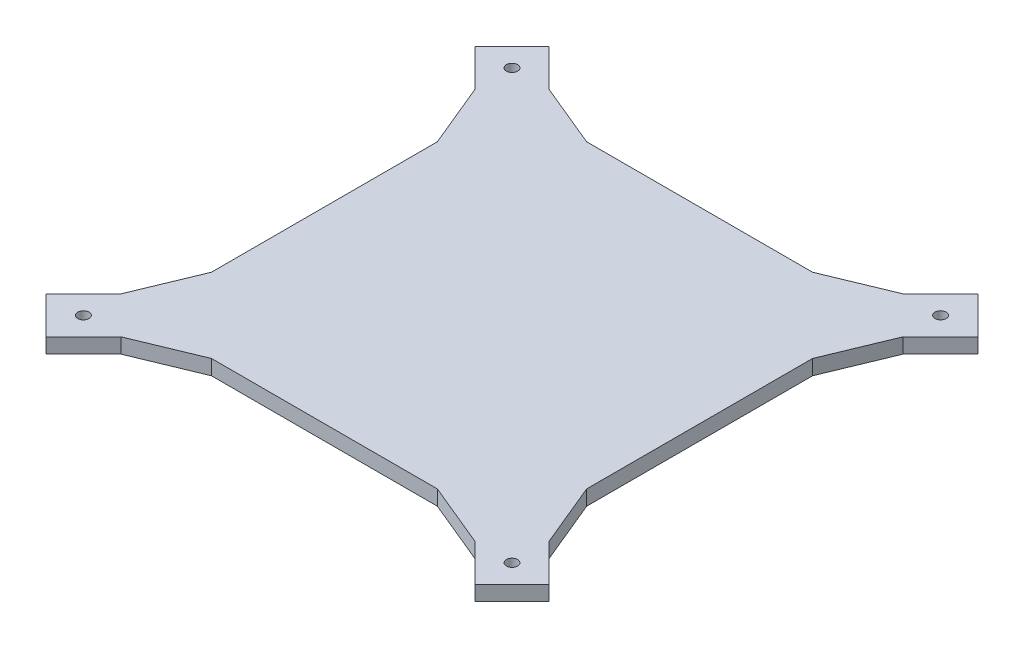
ISO-10303-21;
HEADER;
FILE_DESCRIPTION(('STEP AP214'),'2;1');
FILE_NAME('part.step','',(''),(''),'','','');
FILE_SCHEMA(('AUTOMOTIVE_DESIGN { 1 0 10303 214 1 1 1 1 }'));
ENDSEC;
DATA;
#1=APPLICATION_CONTEXT('core data for automotive mechanical design processes');
#2=APPLICATION_PROTOCOL_DEFINITION('international standard','automotive_design',2000,#1);
#3=PRODUCT_CONTEXT('',#1,'mechanical');
#4=PRODUCT('Part','Part','',(#3));
#5=PRODUCT_RELATED_PRODUCT_CATEGORY('part','',(#4));
#6=PRODUCT_DEFINITION_FORMATION('','',#4);
#7=PRODUCT_DEFINITION_CONTEXT('part definition',#1,'design');
#8=PRODUCT_DEFINITION('design','',#6,#7);
#9=PRODUCT_DEFINITION_SHAPE('','',#8);
#10=(LENGTH_UNIT() NAMED_UNIT(*) SI_UNIT(.MILLI.,.METRE.));
#11=(NAMED_UNIT(*) PLANE_ANGLE_UNIT() SI_UNIT($,.RADIAN.));
#12=(NAMED_UNIT(*) SI_UNIT($,.STERADIAN.) SOLID_ANGLE_UNIT());
#13=UNCERTAINTY_MEASURE_WITH_UNIT(LENGTH_MEASURE(1.E-05),#10,'distance_accuracy_value','');
#14=(GEOMETRIC_REPRESENTATION_CONTEXT(3) GLOBAL_UNCERTAINTY_ASSIGNED_CONTEXT((#13)) GLOBAL_UNIT_ASSIGNED_CONTEXT((#10,
#11,#12)) REPRESENTATION_CONTEXT('',''));
#15=CARTESIAN_POINT('',(0.,0.,0.));
#16=DIRECTION('',(0.,0.,1.));
#17=DIRECTION('',(1.,0.,0.));
#18=AXIS2_PLACEMENT_3D('',#15,#16,#17);
#19=CARTESIAN_POINT('',(0.,4.,0.));
#20=DIRECTION('',(0.,1.,0.));
#21=DIRECTION('',(0.,0.,1.));
#22=AXIS2_PLACEMENT_3D('',#19,#20,#21);
#23=PLANE('',#22);
#24=CARTESIAN_POINT('',(-57.106667948251,4.,-57.1066679482488));
#25=DIRECTION('',(0.,1.,0.));
#26=DIRECTION('',(0.,0.,-1.));
#27=AXIS2_PLACEMENT_3D('',#24,#25,#26);
#28=CIRCLE('',#27,1.5);
#29=CARTESIAN_POINT('',(-57.106667948251,4.,-58.6066679482488));
#30=VERTEX_POINT('',#29);
#31=EDGE_CURVE('E447',#30,#30,#28,.T.);
#32=ORIENTED_EDGE('',*,*,#31,.F.);
#33=EDGE_LOOP('',(#32));
#34=FACE_BOUND('',#33,.T.);
#35=CARTESIAN_POINT('',(57.1066679482514,4.,57.1066679482484));
#36=DIRECTION('',(0.,1.,0.));
#37=DIRECTION('',(0.,0.,-1.));
#38=AXIS2_PLACEMENT_3D('',#35,#36,#37);
#39=CIRCLE('',#38,1.50000000000002);
#40=CARTESIAN_POINT('',(57.1066679482514,4.,55.6066679482483));
#41=VERTEX_POINT('',#40);
#42=EDGE_CURVE('E230',#41,#41,#39,.T.);
#43=ORIENTED_EDGE('',*,*,#42,.F.);
#44=EDGE_LOOP('',(#43));
#45=FACE_BOUND('',#44,.T.);
#46=DIRECTION('',(0.70710678118656,0.,-0.707106781186535));
#47=VECTOR('',#46,1.);
#48=CARTESIAN_POINT('',(-57.1422680846369,4.,67.0417630212437));
#49=LINE('',#48,#47);
#50=CARTESIAN_POINT('',(-57.1422680846369,4.,67.0417630212437));
#51=VERTEX_POINT('',#50);
#52=CARTESIAN_POINT('',(-47.1715728752561,4.,57.0710678118632));
#53=VERTEX_POINT('',#52);
#54=EDGE_CURVE('E273',#51,#53,#49,.T.);
#55=ORIENTED_EDGE('',*,*,#54,.T.);
#56=DIRECTION('',(0.92387953251129,0.,-0.382683432365081));
#57=VECTOR('',#56,1.);
#58=CARTESIAN_POINT('',(-47.1715728752561,4.,57.0710678118632));
#59=LINE('',#58,#57);
#60=CARTESIAN_POINT('',(-30.1005050633905,4.,49.9999999999979));
#61=VERTEX_POINT('',#60);
#62=EDGE_CURVE('E141',#53,#61,#59,.T.);
#63=ORIENTED_EDGE('',*,*,#62,.T.);
#64=DIRECTION('',(1.,0.,0.));
#65=VECTOR('',#64,1.);
#66=CARTESIAN_POINT('',(-30.1005050633905,4.,49.9999999999979));
#67=LINE('',#66,#65);
#68=CARTESIAN_POINT('',(30.100505063389,4.,49.9999999999976));
#69=VERTEX_POINT('',#68);
#70=EDGE_CURVE('E336',#61,#69,#67,.T.);
#71=ORIENTED_EDGE('',*,*,#70,.T.);
#72=DIRECTION('',(0.923879532511286,0.,0.382683432365092));
#73=VECTOR('',#72,1.);
#74=CARTESIAN_POINT('',(47.1715728752544,4.,57.0710678118631));
#75=LINE('',#74,#73);
#76=CARTESIAN_POINT('',(47.1715728752544,4.,57.0710678118631));
#77=VERTEX_POINT('',#76);
#78=EDGE_CURVE('E355',#69,#77,#75,.T.);
#79=ORIENTED_EDGE('',*,*,#78,.T.);
#80=DIRECTION('',(0.707106781186556,0.,0.707106781186539));
#81=VECTOR('',#80,1.);
#82=CARTESIAN_POINT('',(57.1422680846377,4.,67.0417630212461));
#83=LINE('',#82,#81);
#84=CARTESIAN_POINT('',(57.1422680846377,4.,67.0417630212461));
#85=VERTEX_POINT('',#84);
#86=EDGE_CURVE('E352',#77,#85,#83,.T.);
#87=ORIENTED_EDGE('',*,*,#86,.T.);
#88=DIRECTION('',(0.707106781186539,0.,-0.707106781186556));
#89=VECTOR('',#88,1.);
#90=CARTESIAN_POINT('',(67.0417630212479,4.,57.1422680846357));
#91=LINE('',#90,#89);
#92=CARTESIAN_POINT('',(67.0417630212479,4.,57.1422680846357));
#93=VERTEX_POINT('',#92);
#94=EDGE_CURVE('E354',#85,#93,#91,.T.);
#95=ORIENTED_EDGE('',*,*,#94,.T.);
#96=DIRECTION('',(-0.707106781186552,0.,-0.707106781186543));
#97=VECTOR('',#96,1.);
#98=CARTESIAN_POINT('',(57.0710678118651,4.,47.171572875253));
#99=LINE('',#98,#97);
#100=CARTESIAN_POINT('',(57.0710678118651,4.,47.171572875253));
#101=VERTEX_POINT('',#100);
#102=EDGE_CURVE('E357',#93,#101,#99,.T.);
#103=ORIENTED_EDGE('',*,*,#102,.T.);
#104=DIRECTION('',(-0.382683432365093,0.,-0.923879532511286));
#105=VECTOR('',#104,1.);
#106=CARTESIAN_POINT('',(49.9999999999995,4.,30.1005050633876));
#107=LINE('',#106,#105);
#108=CARTESIAN_POINT('',(49.9999999999995,4.,30.1005050633876));
#109=VERTEX_POINT('',#108);
#110=EDGE_CURVE('E363',#101,#109,#107,.T.);
#111=ORIENTED_EDGE('',*,*,#110,.T.);
#112=DIRECTION('',(0.,0.,-1.));
#113=VECTOR('',#112,1.);
#114=CARTESIAN_POINT('',(49.9999999999995,4.,30.1005050633876));
#115=LINE('',#114,#113);
#116=CARTESIAN_POINT('',(49.9999999999995,4.,-30.100505063389));
#117=VERTEX_POINT('',#116);
#118=EDGE_CURVE('E365',#109,#117,#115,.T.);
#119=ORIENTED_EDGE('',*,*,#118,.T.);
#120=DIRECTION('',(0.382683432365099,0.,-0.923879532511283));
#121=VECTOR('',#120,1.);
#122=CARTESIAN_POINT('',(49.9999999999995,4.,-30.100505063389));
#123=LINE('',#122,#121);
#124=CARTESIAN_POINT('',(57.0710678118652,4.,-47.1715728752543));
#125=VERTEX_POINT('',#124);
#126=EDGE_CURVE('E367',#117,#125,#123,.T.);
#127=ORIENTED_EDGE('',*,*,#126,.T.);
#128=DIRECTION('',(0.70710678118656,0.,-0.707106781186535));
#129=VECTOR('',#128,1.);
#130=CARTESIAN_POINT('',(57.0710678118652,4.,-47.1715728752543));
#131=LINE('',#130,#129);
#132=CARTESIAN_POINT('',(67.0417630212457,4.,-57.1422680846345));
#133=VERTEX_POINT('',#132);
#134=EDGE_CURVE('E369',#125,#133,#131,.T.);
#135=ORIENTED_EDGE('',*,*,#134,.T.);
#136=DIRECTION('',(-0.707106781186535,0.,-0.70710678118656));
#137=VECTOR('',#136,1.);
#138=CARTESIAN_POINT('',(67.0417630212457,4.,-57.1422680846345));
#139=LINE('',#138,#137);
#140=CARTESIAN_POINT('',(57.1422680846342,4.,-67.0417630212463));
#141=VERTEX_POINT('',#140);
#142=EDGE_CURVE('E371',#133,#141,#139,.T.);
#143=ORIENTED_EDGE('',*,*,#142,.T.);
#144=DIRECTION('',(-0.707106781186547,0.,0.707106781186548));
#145=VECTOR('',#144,1.);
#146=CARTESIAN_POINT('',(57.1422680846342,4.,-67.0417630212463));
#147=LINE('',#146,#145);
#148=CARTESIAN_POINT('',(47.1715728752535,4.,-57.0710678118656));
#149=VERTEX_POINT('',#148);
#150=EDGE_CURVE('E373',#141,#149,#147,.T.);
#151=ORIENTED_EDGE('',*,*,#150,.T.);
#152=DIRECTION('',(-0.923879532511287,0.,0.38268343236509));
#153=VECTOR('',#152,1.);
#154=CARTESIAN_POINT('',(47.1715728752535,4.,-57.0710678118656));
#155=LINE('',#154,#153);
#156=CARTESIAN_POINT('',(30.1005050633881,4.,-50.0000000000001));
#157=VERTEX_POINT('',#156);
#158=EDGE_CURVE('E375',#149,#157,#155,.T.);
#159=ORIENTED_EDGE('',*,*,#158,.T.);
#160=DIRECTION('',(-1.,0.,0.));
#161=VECTOR('',#160,1.);
#162=CARTESIAN_POINT('',(-30.1005050633893,4.,-50.0000000000001));
#163=LINE('',#162,#161);
#164=CARTESIAN_POINT('',(-30.1005050633893,4.,-50.0000000000001));
#165=VERTEX_POINT('',#164);
#166=EDGE_CURVE('E377',#157,#165,#163,.T.);
#167=ORIENTED_EDGE('',*,*,#166,.T.);
#168=DIRECTION('',(-0.923879532511288,0.,-0.382683432365088));
#169=VECTOR('',#168,1.);
#170=CARTESIAN_POINT('',(-47.1715728752548,4.,-57.0710678118656));
#171=LINE('',#170,#169);
#172=CARTESIAN_POINT('',(-47.1715728752548,4.,-57.0710678118656));
#173=VERTEX_POINT('',#172);
#174=EDGE_CURVE('E379',#165,#173,#171,.T.);
#175=ORIENTED_EDGE('',*,*,#174,.T.);
#176=DIRECTION('',(-0.70710678118655,0.,-0.707106781186544));
#177=VECTOR('',#176,1.);
#178=CARTESIAN_POINT('',(-57.142268084633,4.,-67.0417630212437));
#179=LINE('',#178,#177);
#180=CARTESIAN_POINT('',(-57.142268084633,4.,-67.0417630212437));
#181=VERTEX_POINT('',#180);
#182=EDGE_CURVE('E381',#173,#181,#179,.T.);
#183=ORIENTED_EDGE('',*,*,#182,.T.);
#184=DIRECTION('',(-0.707106781186527,0.,0.707106781186568));
#185=VECTOR('',#184,1.);
#186=CARTESIAN_POINT('',(-67.0417630212446,4.,-57.1422680846316));
#187=LINE('',#186,#185);
#188=CARTESIAN_POINT('',(-67.0417630212446,4.,-57.1422680846316));
#189=VERTEX_POINT('',#188);
#190=EDGE_CURVE('E383',#181,#189,#187,.T.);
#191=ORIENTED_EDGE('',*,*,#190,.T.);
#192=DIRECTION('',(0.707106781186568,0.,0.707106781186527));
#193=VECTOR('',#192,1.);
#194=CARTESIAN_POINT('',(-57.0710678118655,4.,-47.1715728752531));
#195=LINE('',#194,#193);
#196=CARTESIAN_POINT('',(-57.0710678118655,4.,-47.1715728752531));
#197=VERTEX_POINT('',#196);
#198=EDGE_CURVE('E385',#189,#197,#195,.T.);
#199=ORIENTED_EDGE('',*,*,#198,.T.);
#200=DIRECTION('',(0.382683432365095,0.,0.923879532511285));
#201=VECTOR('',#200,1.);
#202=CARTESIAN_POINT('',(-50.,4.,-30.1005050633877));
#203=LINE('',#202,#201);
#204=CARTESIAN_POINT('',(-50.,4.,-30.1005050633877));
#205=VERTEX_POINT('',#204);
#206=EDGE_CURVE('E387',#197,#205,#203,.T.);
#207=ORIENTED_EDGE('',*,*,#206,.T.);
#208=DIRECTION('',(0.,0.,1.));
#209=VECTOR('',#208,1.);
#210=CARTESIAN_POINT('',(-49.9999999999997,4.,30.1005050633888));
#211=LINE('',#210,#209);
#212=CARTESIAN_POINT('',(-49.9999999999997,4.,30.1005050633888));
#213=VERTEX_POINT('',#212);
#214=EDGE_CURVE('E208',#205,#213,#211,.T.);
#215=ORIENTED_EDGE('',*,*,#214,.T.);
#216=DIRECTION('',(-0.382683432365098,0.,0.923879532511284));
#217=VECTOR('',#216,1.);
#218=CARTESIAN_POINT('',(-49.9999999999997,4.,30.1005050633888));
#219=LINE('',#218,#217);
#220=CARTESIAN_POINT('',(-57.0710678118653,4.,47.1715728752541));
#221=VERTEX_POINT('',#220);
#222=EDGE_CURVE('E202',#213,#221,#219,.T.);
#223=ORIENTED_EDGE('',*,*,#222,.T.);
#224=DIRECTION('',(-0.70710678118656,0.,0.707106781186535));
#225=VECTOR('',#224,1.);
#226=CARTESIAN_POINT('',(-57.0710678118653,4.,47.1715728752541));
#227=LINE('',#226,#225);
#228=CARTESIAN_POINT('',(-67.0417630212459,4.,57.1422680846344));
#229=VERTEX_POINT('',#228);
#230=EDGE_CURVE('E206',#221,#229,#227,.T.);
#231=ORIENTED_EDGE('',*,*,#230,.T.);
#232=DIRECTION('',(0.707106781186535,0.,0.70710678118656));
#233=VECTOR('',#232,1.);
#234=CARTESIAN_POINT('',(-67.0417630212459,4.,57.1422680846344));
#235=LINE('',#234,#233);
#236=EDGE_CURVE('E50',#229,#51,#235,.T.);
#237=ORIENTED_EDGE('',*,*,#236,.T.);
#238=EDGE_LOOP('',(#55,#63,#71,#79,#87,#95,#103,#111,#119,#127,#135,#143,#151,#159,#167,#175,
#183,#191,#199,#207,#215,#223,#231,#237));
#239=FACE_BOUND('',#238,.T.);
#240=CARTESIAN_POINT('',(-57.106667948251,4.,57.1066679482488));
#241=DIRECTION('',(0.,1.,0.));
#242=DIRECTION('',(0.,0.,1.));
#243=AXIS2_PLACEMENT_3D('',#240,#241,#242);
#244=CIRCLE('',#243,1.5);
#245=CARTESIAN_POINT('',(-57.106667948251,4.,58.6066679482488));
#246=VERTEX_POINT('',#245);
#247=EDGE_CURVE('E453',#246,#246,#244,.T.);
#248=ORIENTED_EDGE('',*,*,#247,.F.);
#249=EDGE_LOOP('',(#248));
#250=FACE_BOUND('',#249,.T.);
#251=CARTESIAN_POINT('',(57.1066679482506,4.,-57.1066679482492));
#252=DIRECTION('',(0.,1.,0.));
#253=DIRECTION('',(0.,0.,1.));
#254=AXIS2_PLACEMENT_3D('',#251,#252,#253);
#255=CIRCLE('',#254,1.5);
#256=CARTESIAN_POINT('',(57.1066679482506,4.,-55.6066679482492));
#257=VERTEX_POINT('',#256);
#258=EDGE_CURVE('E438',#257,#257,#255,.T.);
#259=ORIENTED_EDGE('',*,*,#258,.F.);
#260=EDGE_LOOP('',(#259));
#261=FACE_BOUND('',#260,.T.);
#262=ADVANCED_FACE('F33',(#34,#45,#239,#250,#261),#23,.T.);
#263=CARTESIAN_POINT('',(0.,0.,0.));
#264=DIRECTION('',(0.,1.,0.));
#265=DIRECTION('',(0.,0.,1.));
#266=AXIS2_PLACEMENT_3D('',#263,#264,#265);
#267=PLANE('',#266);
#268=DIRECTION('',(0.70710678118656,0.,-0.707106781186535));
#269=VECTOR('',#268,1.);
#270=CARTESIAN_POINT('',(-57.1422680846369,0.,67.0417630212437));
#271=LINE('',#270,#269);
#272=CARTESIAN_POINT('',(-57.1422680846369,0.,67.0417630212437));
#273=VERTEX_POINT('',#272);
#274=CARTESIAN_POINT('',(-47.1715728752561,0.,57.0710678118632));
#275=VERTEX_POINT('',#274);
#276=EDGE_CURVE('E226',#273,#275,#271,.T.);
#277=ORIENTED_EDGE('',*,*,#276,.F.);
#278=DIRECTION('',(0.707106781186535,0.,0.70710678118656));
#279=VECTOR('',#278,1.);
#280=CARTESIAN_POINT('',(-67.0417630212459,0.,57.1422680846344));
#281=LINE('',#280,#279);
#282=CARTESIAN_POINT('',(-67.0417630212459,0.,57.1422680846344));
#283=VERTEX_POINT('',#282);
#284=EDGE_CURVE('E133',#283,#273,#281,.T.);
#285=ORIENTED_EDGE('',*,*,#284,.F.);
#286=DIRECTION('',(-0.70710678118656,0.,0.707106781186535));
#287=VECTOR('',#286,1.);
#288=CARTESIAN_POINT('',(-57.0710678118653,0.,47.1715728752541));
#289=LINE('',#288,#287);
#290=CARTESIAN_POINT('',(-57.0710678118653,0.,47.1715728752541));
#291=VERTEX_POINT('',#290);
#292=EDGE_CURVE('E127',#291,#283,#289,.T.);
#293=ORIENTED_EDGE('',*,*,#292,.F.);
#294=DIRECTION('',(-0.382683432365098,0.,0.923879532511284));
#295=VECTOR('',#294,1.);
#296=CARTESIAN_POINT('',(-49.9999999999997,0.,30.1005050633888));
#297=LINE('',#296,#295);
#298=CARTESIAN_POINT('',(-49.9999999999997,0.,30.1005050633888));
#299=VERTEX_POINT('',#298);
#300=EDGE_CURVE('E216',#299,#291,#297,.T.);
#301=ORIENTED_EDGE('',*,*,#300,.F.);
#302=DIRECTION('',(0.,0.,1.));
#303=VECTOR('',#302,1.);
#304=CARTESIAN_POINT('',(-49.9999999999997,0.,30.1005050633888));
#305=LINE('',#304,#303);
#306=CARTESIAN_POINT('',(-50.,0.,-30.1005050633877));
#307=VERTEX_POINT('',#306);
#308=EDGE_CURVE('E268',#307,#299,#305,.T.);
#309=ORIENTED_EDGE('',*,*,#308,.F.);
#310=DIRECTION('',(0.382683432365095,0.,0.923879532511285));
#311=VECTOR('',#310,1.);
#312=CARTESIAN_POINT('',(-50.,0.,-30.1005050633877));
#313=LINE('',#312,#311);
#314=CARTESIAN_POINT('',(-57.0710678118655,0.,-47.1715728752531));
#315=VERTEX_POINT('',#314);
#316=EDGE_CURVE('E266',#315,#307,#313,.T.);
#317=ORIENTED_EDGE('',*,*,#316,.F.);
#318=DIRECTION('',(0.707106781186568,0.,0.707106781186527));
#319=VECTOR('',#318,1.);
#320=CARTESIAN_POINT('',(-57.0710678118655,0.,-47.1715728752531));
#321=LINE('',#320,#319);
#322=CARTESIAN_POINT('',(-67.0417630212446,0.,-57.1422680846316));
#323=VERTEX_POINT('',#322);
#324=EDGE_CURVE('E264',#323,#315,#321,.T.);
#325=ORIENTED_EDGE('',*,*,#324,.F.);
#326=DIRECTION('',(-0.707106781186527,0.,0.707106781186568));
#327=VECTOR('',#326,1.);
#328=CARTESIAN_POINT('',(-67.0417630212446,0.,-57.1422680846316));
#329=LINE('',#328,#327);
#330=CARTESIAN_POINT('',(-57.142268084633,0.,-67.0417630212437));
#331=VERTEX_POINT('',#330);
#332=EDGE_CURVE('E262',#331,#323,#329,.T.);
#333=ORIENTED_EDGE('',*,*,#332,.F.);
#334=DIRECTION('',(-0.70710678118655,0.,-0.707106781186544));
#335=VECTOR('',#334,1.);
#336=CARTESIAN_POINT('',(-57.142268084633,0.,-67.0417630212437));
#337=LINE('',#336,#335);
#338=CARTESIAN_POINT('',(-47.1715728752548,0.,-57.0710678118656));
#339=VERTEX_POINT('',#338);
#340=EDGE_CURVE('E260',#339,#331,#337,.T.);
#341=ORIENTED_EDGE('',*,*,#340,.F.);
#342=DIRECTION('',(-0.923879532511288,0.,-0.382683432365088));
#343=VECTOR('',#342,1.);
#344=CARTESIAN_POINT('',(-47.1715728752548,0.,-57.0710678118656));
#345=LINE('',#344,#343);
#346=CARTESIAN_POINT('',(-30.1005050633893,0.,-50.0000000000001));
#347=VERTEX_POINT('',#346);
#348=EDGE_CURVE('E258',#347,#339,#345,.T.);
#349=ORIENTED_EDGE('',*,*,#348,.F.);
#350=DIRECTION('',(-1.,0.,0.));
#351=VECTOR('',#350,1.);
#352=CARTESIAN_POINT('',(-30.1005050633893,0.,-50.0000000000001));
#353=LINE('',#352,#351);
#354=CARTESIAN_POINT('',(30.1005050633881,0.,-50.0000000000001));
#355=VERTEX_POINT('',#354);
#356=EDGE_CURVE('E256',#355,#347,#353,.T.);
#357=ORIENTED_EDGE('',*,*,#356,.F.);
#358=DIRECTION('',(-0.923879532511287,0.,0.38268343236509));
#359=VECTOR('',#358,1.);
#360=CARTESIAN_POINT('',(47.1715728752535,0.,-57.0710678118656));
#361=LINE('',#360,#359);
#362=CARTESIAN_POINT('',(47.1715728752535,0.,-57.0710678118656));
#363=VERTEX_POINT('',#362);
#364=EDGE_CURVE('E254',#363,#355,#361,.T.);
#365=ORIENTED_EDGE('',*,*,#364,.F.);
#366=DIRECTION('',(-0.707106781186547,0.,0.707106781186548));
#367=VECTOR('',#366,1.);
#368=CARTESIAN_POINT('',(57.1422680846342,0.,-67.0417630212463));
#369=LINE('',#368,#367);
#370=CARTESIAN_POINT('',(57.1422680846342,0.,-67.0417630212463));
#371=VERTEX_POINT('',#370);
#372=EDGE_CURVE('E252',#371,#363,#369,.T.);
#373=ORIENTED_EDGE('',*,*,#372,.F.);
#374=DIRECTION('',(-0.707106781186535,0.,-0.70710678118656));
#375=VECTOR('',#374,1.);
#376=CARTESIAN_POINT('',(67.0417630212457,0.,-57.1422680846345));
#377=LINE('',#376,#375);
#378=CARTESIAN_POINT('',(67.0417630212457,0.,-57.1422680846345));
#379=VERTEX_POINT('',#378);
#380=EDGE_CURVE('E250',#379,#371,#377,.T.);
#381=ORIENTED_EDGE('',*,*,#380,.F.);
#382=DIRECTION('',(0.70710678118656,0.,-0.707106781186535));
#383=VECTOR('',#382,1.);
#384=CARTESIAN_POINT('',(57.0710678118652,0.,-47.1715728752543));
#385=LINE('',#384,#383);
#386=CARTESIAN_POINT('',(57.0710678118652,0.,-47.1715728752543));
#387=VERTEX_POINT('',#386);
#388=EDGE_CURVE('E248',#387,#379,#385,.T.);
#389=ORIENTED_EDGE('',*,*,#388,.F.);
#390=DIRECTION('',(0.382683432365099,0.,-0.923879532511283));
#391=VECTOR('',#390,1.);
#392=CARTESIAN_POINT('',(49.9999999999995,0.,-30.100505063389));
#393=LINE('',#392,#391);
#394=CARTESIAN_POINT('',(49.9999999999995,0.,-30.100505063389));
#395=VERTEX_POINT('',#394);
#396=EDGE_CURVE('E246',#395,#387,#393,.T.);
#397=ORIENTED_EDGE('',*,*,#396,.F.);
#398=DIRECTION('',(0.,0.,-1.));
#399=VECTOR('',#398,1.);
#400=CARTESIAN_POINT('',(49.9999999999995,0.,30.1005050633876));
#401=LINE('',#400,#399);
#402=CARTESIAN_POINT('',(49.9999999999995,0.,30.1005050633876));
#403=VERTEX_POINT('',#402);
#404=EDGE_CURVE('E244',#403,#395,#401,.T.);
#405=ORIENTED_EDGE('',*,*,#404,.F.);
#406=DIRECTION('',(-0.382683432365093,0.,-0.923879532511286));
#407=VECTOR('',#406,1.);
#408=CARTESIAN_POINT('',(49.9999999999995,0.,30.1005050633876));
#409=LINE('',#408,#407);
#410=CARTESIAN_POINT('',(57.0710678118651,0.,47.171572875253));
#411=VERTEX_POINT('',#410);
#412=EDGE_CURVE('E242',#411,#403,#409,.T.);
#413=ORIENTED_EDGE('',*,*,#412,.F.);
#414=DIRECTION('',(-0.707106781186552,0.,-0.707106781186543));
#415=VECTOR('',#414,1.);
#416=CARTESIAN_POINT('',(57.0710678118651,0.,47.171572875253));
#417=LINE('',#416,#415);
#418=CARTESIAN_POINT('',(67.0417630212479,0.,57.1422680846357));
#419=VERTEX_POINT('',#418);
#420=EDGE_CURVE('E240',#419,#411,#417,.T.);
#421=ORIENTED_EDGE('',*,*,#420,.F.);
#422=DIRECTION('',(0.707106781186539,0.,-0.707106781186556));
#423=VECTOR('',#422,1.);
#424=CARTESIAN_POINT('',(67.0417630212479,0.,57.1422680846357));
#425=LINE('',#424,#423);
#426=CARTESIAN_POINT('',(57.1422680846377,0.,67.0417630212461));
#427=VERTEX_POINT('',#426);
#428=EDGE_CURVE('E238',#427,#419,#425,.T.);
#429=ORIENTED_EDGE('',*,*,#428,.F.);
#430=DIRECTION('',(0.707106781186556,0.,0.707106781186539));
#431=VECTOR('',#430,1.);
#432=CARTESIAN_POINT('',(57.1422680846377,0.,67.0417630212461));
#433=LINE('',#432,#431);
#434=CARTESIAN_POINT('',(47.1715728752544,0.,57.0710678118631));
#435=VERTEX_POINT('',#434);
#436=EDGE_CURVE('E236',#435,#427,#433,.T.);
#437=ORIENTED_EDGE('',*,*,#436,.F.);
#438=DIRECTION('',(0.923879532511286,0.,0.382683432365092));
#439=VECTOR('',#438,1.);
#440=CARTESIAN_POINT('',(47.1715728752544,0.,57.0710678118631));
#441=LINE('',#440,#439);
#442=CARTESIAN_POINT('',(30.100505063389,0.,49.9999999999976));
#443=VERTEX_POINT('',#442);
#444=EDGE_CURVE('E234',#443,#435,#441,.T.);
#445=ORIENTED_EDGE('',*,*,#444,.F.);
#446=DIRECTION('',(1.,0.,0.));
#447=VECTOR('',#446,1.);
#448=CARTESIAN_POINT('',(-30.1005050633905,0.,49.9999999999979));
#449=LINE('',#448,#447);
#450=CARTESIAN_POINT('',(-30.1005050633905,0.,49.9999999999979));
#451=VERTEX_POINT('',#450);
#452=EDGE_CURVE('E232',#451,#443,#449,.T.);
#453=ORIENTED_EDGE('',*,*,#452,.F.);
#454=DIRECTION('',(0.92387953251129,0.,-0.382683432365081));
#455=VECTOR('',#454,1.);
#456=CARTESIAN_POINT('',(-47.1715728752561,0.,57.0710678118632));
#457=LINE('',#456,#455);
#458=EDGE_CURVE('E229',#275,#451,#457,.T.);
#459=ORIENTED_EDGE('',*,*,#458,.F.);
#460=EDGE_LOOP('',(#277,#285,#293,#301,#309,#317,#325,#333,#341,#349,#357,#365,#373,#381,#389,
#397,#405,#413,#421,#429,#437,#445,#453,#459));
#461=FACE_BOUND('',#460,.T.);
#462=CARTESIAN_POINT('',(57.1066679482514,0.,57.1066679482484));
#463=DIRECTION('',(0.,1.,0.));
#464=DIRECTION('',(0.,0.,-1.));
#465=AXIS2_PLACEMENT_3D('',#462,#463,#464);
#466=CIRCLE('',#465,1.50000000000002);
#467=CARTESIAN_POINT('',(57.1066679482514,0.,55.6066679482483));
#468=VERTEX_POINT('',#467);
#469=EDGE_CURVE('E456',#468,#468,#466,.T.);
#470=ORIENTED_EDGE('',*,*,#469,.T.);
#471=EDGE_LOOP('',(#470));
#472=FACE_BOUND('',#471,.T.);
#473=CARTESIAN_POINT('',(-57.106667948251,0.,57.1066679482488));
#474=DIRECTION('',(0.,1.,0.));
#475=DIRECTION('',(0.,0.,1.));
#476=AXIS2_PLACEMENT_3D('',#473,#474,#475);
#477=CIRCLE('',#476,1.5);
#478=CARTESIAN_POINT('',(-57.106667948251,0.,58.6066679482488));
#479=VERTEX_POINT('',#478);
#480=EDGE_CURVE('E450',#479,#479,#477,.T.);
#481=ORIENTED_EDGE('',*,*,#480,.T.);
#482=EDGE_LOOP('',(#481));
#483=FACE_BOUND('',#482,.T.);
#484=CARTESIAN_POINT('',(-57.106667948251,0.,-57.1066679482488));
#485=DIRECTION('',(0.,1.,0.));
#486=DIRECTION('',(0.,0.,-1.));
#487=AXIS2_PLACEMENT_3D('',#484,#485,#486);
#488=CIRCLE('',#487,1.5);
#489=CARTESIAN_POINT('',(-57.106667948251,0.,-58.6066679482488));
#490=VERTEX_POINT('',#489);
#491=EDGE_CURVE('E444',#490,#490,#488,.T.);
#492=ORIENTED_EDGE('',*,*,#491,.T.);
#493=EDGE_LOOP('',(#492));
#494=FACE_BOUND('',#493,.T.);
#495=CARTESIAN_POINT('',(57.1066679482506,0.,-57.1066679482492));
#496=DIRECTION('',(0.,1.,0.));
#497=DIRECTION('',(0.,0.,1.));
#498=AXIS2_PLACEMENT_3D('',#495,#496,#497);
#499=CIRCLE('',#498,1.5);
#500=CARTESIAN_POINT('',(57.1066679482506,0.,-55.6066679482492));
#501=VERTEX_POINT('',#500);
#502=EDGE_CURVE('E441',#501,#501,#499,.T.);
#503=ORIENTED_EDGE('',*,*,#502,.T.);
#504=EDGE_LOOP('',(#503));
#505=FACE_BOUND('',#504,.T.);
#506=ADVANCED_FACE('F340',(#461,#472,#483,#494,#505),#267,.F.);
#507=CARTESIAN_POINT('',(-57.1422680846369,4.,67.0417630212437));
#508=DIRECTION('',(-0.707106781186535,0.,-0.70710678118656));
#509=DIRECTION('',(-0.70710678118656,0.,0.707106781186535));
#510=AXIS2_PLACEMENT_3D('',#507,#508,#509);
#511=PLANE('',#510);
#512=ORIENTED_EDGE('',*,*,#276,.T.);
#513=DIRECTION('',(0.,-1.,0.));
#514=VECTOR('',#513,1.);
#515=CARTESIAN_POINT('',(-47.1715728752561,4.,57.0710678118632));
#516=LINE('',#515,#514);
#517=EDGE_CURVE('E11',#53,#275,#516,.T.);
#518=ORIENTED_EDGE('',*,*,#517,.F.);
#519=ORIENTED_EDGE('',*,*,#54,.F.);
#520=DIRECTION('',(0.,-1.,0.));
#521=VECTOR('',#520,1.);
#522=CARTESIAN_POINT('',(-57.1422680846369,4.,67.0417630212437));
#523=LINE('',#522,#521);
#524=EDGE_CURVE('E222',#51,#273,#523,.T.);
#525=ORIENTED_EDGE('',*,*,#524,.T.);
#526=EDGE_LOOP('',(#512,#518,#519,#525));
#527=FACE_BOUND('',#526,.T.);
#528=ADVANCED_FACE('F35',(#527),#511,.F.);
#529=CARTESIAN_POINT('',(-47.1715728752561,4.,57.0710678118632));
#530=DIRECTION('',(-0.382683432365081,0.,-0.92387953251129));
#531=DIRECTION('',(-0.92387953251129,0.,0.382683432365081));
#532=AXIS2_PLACEMENT_3D('',#529,#530,#531);
#533=PLANE('',#532);
#534=ORIENTED_EDGE('',*,*,#458,.T.);
#535=DIRECTION('',(0.,-1.,0.));
#536=VECTOR('',#535,1.);
#537=CARTESIAN_POINT('',(-30.1005050633905,4.,49.9999999999979));
#538=LINE('',#537,#536);
#539=EDGE_CURVE('E42',#61,#451,#538,.T.);
#540=ORIENTED_EDGE('',*,*,#539,.F.);
#541=ORIENTED_EDGE('',*,*,#62,.F.);
#542=ORIENTED_EDGE('',*,*,#517,.T.);
#543=EDGE_LOOP('',(#534,#540,#541,#542));
#544=FACE_BOUND('',#543,.T.);
#545=ADVANCED_FACE('F686',(#544),#533,.F.);
#546=CARTESIAN_POINT('',(-30.1005050633905,4.,49.9999999999979));
#547=DIRECTION('',(0.,0.,-1.));
#548=DIRECTION('',(-1.,0.,0.));
#549=AXIS2_PLACEMENT_3D('',#546,#547,#548);
#550=PLANE('',#549);
#551=ORIENTED_EDGE('',*,*,#452,.T.);
#552=DIRECTION('',(0.,-1.,0.));
#553=VECTOR('',#552,1.);
#554=CARTESIAN_POINT('',(30.100505063389,4.,49.9999999999976));
#555=LINE('',#554,#553);
#556=EDGE_CURVE('E328',#69,#443,#555,.T.);
#557=ORIENTED_EDGE('',*,*,#556,.F.);
#558=ORIENTED_EDGE('',*,*,#70,.F.);
#559=ORIENTED_EDGE('',*,*,#539,.T.);
#560=EDGE_LOOP('',(#551,#557,#558,#559));
#561=FACE_BOUND('',#560,.T.);
#562=ADVANCED_FACE('F334',(#561),#550,.F.);
#563=CARTESIAN_POINT('',(47.1715728752544,4.,57.0710678118631));
#564=DIRECTION('',(0.382683432365092,0.,-0.923879532511286));
#565=DIRECTION('',(-0.923879532511286,0.,-0.382683432365092));
#566=AXIS2_PLACEMENT_3D('',#563,#564,#565);
#567=PLANE('',#566);
#568=ORIENTED_EDGE('',*,*,#444,.T.);
#569=DIRECTION('',(0.,-1.,0.));
#570=VECTOR('',#569,1.);
#571=CARTESIAN_POINT('',(47.1715728752544,4.,57.0710678118631));
#572=LINE('',#571,#570);
#573=EDGE_CURVE('E325',#77,#435,#572,.T.);
#574=ORIENTED_EDGE('',*,*,#573,.F.);
#575=ORIENTED_EDGE('',*,*,#78,.F.);
#576=ORIENTED_EDGE('',*,*,#556,.T.);
#577=EDGE_LOOP('',(#568,#574,#575,#576));
#578=FACE_BOUND('',#577,.T.);
#579=ADVANCED_FACE('F346',(#578),#567,.F.);
#580=CARTESIAN_POINT('',(57.1422680846377,4.,67.0417630212461));
#581=DIRECTION('',(0.707106781186539,0.,-0.707106781186556));
#582=DIRECTION('',(-0.707106781186556,0.,-0.707106781186539));
#583=AXIS2_PLACEMENT_3D('',#580,#581,#582);
#584=PLANE('',#583);
#585=ORIENTED_EDGE('',*,*,#436,.T.);
#586=DIRECTION('',(0.,-1.,0.));
#587=VECTOR('',#586,1.);
#588=CARTESIAN_POINT('',(57.1422680846377,4.,67.0417630212461));
#589=LINE('',#588,#587);
#590=EDGE_CURVE('E322',#85,#427,#589,.T.);
#591=ORIENTED_EDGE('',*,*,#590,.F.);
#592=ORIENTED_EDGE('',*,*,#86,.F.);
#593=ORIENTED_EDGE('',*,*,#573,.T.);
#594=EDGE_LOOP('',(#585,#591,#592,#593));
#595=FACE_BOUND('',#594,.T.);
#596=ADVANCED_FACE('F350',(#595),#584,.F.);
#597=CARTESIAN_POINT('',(67.0417630212479,4.,57.1422680846357));
#598=DIRECTION('',(-0.707106781186556,0.,-0.707106781186539));
#599=DIRECTION('',(-0.707106781186539,0.,0.707106781186556));
#600=AXIS2_PLACEMENT_3D('',#597,#598,#599);
#601=PLANE('',#600);
#602=ORIENTED_EDGE('',*,*,#428,.T.);
#603=DIRECTION('',(0.,-1.,0.));
#604=VECTOR('',#603,1.);
#605=CARTESIAN_POINT('',(67.0417630212479,4.,57.1422680846357));
#606=LINE('',#605,#604);
#607=EDGE_CURVE('E319',#93,#419,#606,.T.);
#608=ORIENTED_EDGE('',*,*,#607,.F.);
#609=ORIENTED_EDGE('',*,*,#94,.F.);
#610=ORIENTED_EDGE('',*,*,#590,.T.);
#611=EDGE_LOOP('',(#602,#608,#609,#610));
#612=FACE_BOUND('',#611,.T.);
#613=ADVANCED_FACE('F651',(#612),#601,.F.);
#614=CARTESIAN_POINT('',(57.0710678118651,4.,47.171572875253));
#615=DIRECTION('',(-0.707106781186543,0.,0.707106781186552));
#616=DIRECTION('',(0.707106781186552,0.,0.707106781186543));
#617=AXIS2_PLACEMENT_3D('',#614,#615,#616);
#618=PLANE('',#617);
#619=ORIENTED_EDGE('',*,*,#420,.T.);
#620=DIRECTION('',(0.,-1.,0.));
#621=VECTOR('',#620,1.);
#622=CARTESIAN_POINT('',(57.0710678118651,4.,47.171572875253));
#623=LINE('',#622,#621);
#624=EDGE_CURVE('E316',#101,#411,#623,.T.);
#625=ORIENTED_EDGE('',*,*,#624,.F.);
#626=ORIENTED_EDGE('',*,*,#102,.F.);
#627=ORIENTED_EDGE('',*,*,#607,.T.);
#628=EDGE_LOOP('',(#619,#625,#626,#627));
#629=FACE_BOUND('',#628,.T.);
#630=ADVANCED_FACE('F641',(#629),#618,.F.);
#631=CARTESIAN_POINT('',(49.9999999999995,4.,30.1005050633876));
#632=DIRECTION('',(-0.923879532511286,0.,0.382683432365093));
#633=DIRECTION('',(0.382683432365093,0.,0.923879532511286));
#634=AXIS2_PLACEMENT_3D('',#631,#632,#633);
#635=PLANE('',#634);
#636=ORIENTED_EDGE('',*,*,#412,.T.);
#637=DIRECTION('',(0.,-1.,0.));
#638=VECTOR('',#637,1.);
#639=CARTESIAN_POINT('',(49.9999999999995,4.,30.1005050633876));
#640=LINE('',#639,#638);
#641=EDGE_CURVE('E313',#109,#403,#640,.T.);
#642=ORIENTED_EDGE('',*,*,#641,.F.);
#643=ORIENTED_EDGE('',*,*,#110,.F.);
#644=ORIENTED_EDGE('',*,*,#624,.T.);
#645=EDGE_LOOP('',(#636,#642,#643,#644));
#646=FACE_BOUND('',#645,.T.);
#647=ADVANCED_FACE('F631',(#646),#635,.F.);
#648=CARTESIAN_POINT('',(49.9999999999995,4.,30.1005050633876));
#649=DIRECTION('',(-1.,0.,0.));
#650=DIRECTION('',(0.,0.,1.));
#651=AXIS2_PLACEMENT_3D('',#648,#649,#650);
#652=PLANE('',#651);
#653=ORIENTED_EDGE('',*,*,#404,.T.);
#654=DIRECTION('',(0.,-1.,0.));
#655=VECTOR('',#654,1.);
#656=CARTESIAN_POINT('',(49.9999999999995,4.,-30.100505063389));
#657=LINE('',#656,#655);
#658=EDGE_CURVE('E310',#117,#395,#657,.T.);
#659=ORIENTED_EDGE('',*,*,#658,.F.);
#660=ORIENTED_EDGE('',*,*,#118,.F.);
#661=ORIENTED_EDGE('',*,*,#641,.T.);
#662=EDGE_LOOP('',(#653,#659,#660,#661));
#663=FACE_BOUND('',#662,.T.);
#664=ADVANCED_FACE('F621',(#663),#652,.F.);
#665=CARTESIAN_POINT('',(49.9999999999995,4.,-30.100505063389));
#666=DIRECTION('',(-0.923879532511283,0.,-0.382683432365099));
#667=DIRECTION('',(-0.382683432365099,0.,0.923879532511283));
#668=AXIS2_PLACEMENT_3D('',#665,#666,#667);
#669=PLANE('',#668);
#670=ORIENTED_EDGE('',*,*,#396,.T.);
#671=DIRECTION('',(0.,-1.,0.));
#672=VECTOR('',#671,1.);
#673=CARTESIAN_POINT('',(57.0710678118652,4.,-47.1715728752543));
#674=LINE('',#673,#672);
#675=EDGE_CURVE('E307',#125,#387,#674,.T.);
#676=ORIENTED_EDGE('',*,*,#675,.F.);
#677=ORIENTED_EDGE('',*,*,#126,.F.);
#678=ORIENTED_EDGE('',*,*,#658,.T.);
#679=EDGE_LOOP('',(#670,#676,#677,#678));
#680=FACE_BOUND('',#679,.T.);
#681=ADVANCED_FACE('F611',(#680),#669,.F.);
#682=CARTESIAN_POINT('',(57.0710678118652,4.,-47.1715728752543));
#683=DIRECTION('',(-0.707106781186535,0.,-0.70710678118656));
#684=DIRECTION('',(-0.70710678118656,0.,0.707106781186535));
#685=AXIS2_PLACEMENT_3D('',#682,#683,#684);
#686=PLANE('',#685);
#687=ORIENTED_EDGE('',*,*,#388,.T.);
#688=DIRECTION('',(0.,-1.,0.));
#689=VECTOR('',#688,1.);
#690=CARTESIAN_POINT('',(67.0417630212457,4.,-57.1422680846345));
#691=LINE('',#690,#689);
#692=EDGE_CURVE('E304',#133,#379,#691,.T.);
#693=ORIENTED_EDGE('',*,*,#692,.F.);
#694=ORIENTED_EDGE('',*,*,#134,.F.);
#695=ORIENTED_EDGE('',*,*,#675,.T.);
#696=EDGE_LOOP('',(#687,#693,#694,#695));
#697=FACE_BOUND('',#696,.T.);
#698=ADVANCED_FACE('F601',(#697),#686,.F.);
#699=CARTESIAN_POINT('',(67.0417630212457,4.,-57.1422680846345));
#700=DIRECTION('',(-0.70710678118656,0.,0.707106781186535));
#701=DIRECTION('',(0.707106781186535,0.,0.70710678118656));
#702=AXIS2_PLACEMENT_3D('',#699,#700,#701);
#703=PLANE('',#702);
#704=ORIENTED_EDGE('',*,*,#380,.T.);
#705=DIRECTION('',(0.,-1.,0.));
#706=VECTOR('',#705,1.);
#707=CARTESIAN_POINT('',(57.1422680846342,4.,-67.0417630212463));
#708=LINE('',#707,#706);
#709=EDGE_CURVE('E301',#141,#371,#708,.T.);
#710=ORIENTED_EDGE('',*,*,#709,.F.);
#711=ORIENTED_EDGE('',*,*,#142,.F.);
#712=ORIENTED_EDGE('',*,*,#692,.T.);
#713=EDGE_LOOP('',(#704,#710,#711,#712));
#714=FACE_BOUND('',#713,.T.);
#715=ADVANCED_FACE('F591',(#714),#703,.F.);
#716=CARTESIAN_POINT('',(57.1422680846342,4.,-67.0417630212463));
#717=DIRECTION('',(0.707106781186548,0.,0.707106781186547));
#718=DIRECTION('',(0.707106781186547,0.,-0.707106781186548));
#719=AXIS2_PLACEMENT_3D('',#716,#717,#718);
#720=PLANE('',#719);
#721=ORIENTED_EDGE('',*,*,#372,.T.);
#722=DIRECTION('',(0.,-1.,0.));
#723=VECTOR('',#722,1.);
#724=CARTESIAN_POINT('',(47.1715728752535,4.,-57.0710678118656));
#725=LINE('',#724,#723);
#726=EDGE_CURVE('E298',#149,#363,#725,.T.);
#727=ORIENTED_EDGE('',*,*,#726,.F.);
#728=ORIENTED_EDGE('',*,*,#150,.F.);
#729=ORIENTED_EDGE('',*,*,#709,.T.);
#730=EDGE_LOOP('',(#721,#727,#728,#729));
#731=FACE_BOUND('',#730,.T.);
#732=ADVANCED_FACE('F581',(#731),#720,.F.);
#733=CARTESIAN_POINT('',(47.1715728752535,4.,-57.0710678118656));
#734=DIRECTION('',(0.38268343236509,0.,0.923879532511287));
#735=DIRECTION('',(0.923879532511287,0.,-0.38268343236509));
#736=AXIS2_PLACEMENT_3D('',#733,#734,#735);
#737=PLANE('',#736);
#738=ORIENTED_EDGE('',*,*,#364,.T.);
#739=DIRECTION('',(0.,-1.,0.));
#740=VECTOR('',#739,1.);
#741=CARTESIAN_POINT('',(30.1005050633881,4.,-50.0000000000001));
#742=LINE('',#741,#740);
#743=EDGE_CURVE('E295',#157,#355,#742,.T.);
#744=ORIENTED_EDGE('',*,*,#743,.F.);
#745=ORIENTED_EDGE('',*,*,#158,.F.);
#746=ORIENTED_EDGE('',*,*,#726,.T.);
#747=EDGE_LOOP('',(#738,#744,#745,#746));
#748=FACE_BOUND('',#747,.T.);
#749=ADVANCED_FACE('F571',(#748),#737,.F.);
#750=CARTESIAN_POINT('',(-30.1005050633893,4.,-50.0000000000001));
#751=DIRECTION('',(0.,0.,1.));
#752=DIRECTION('',(1.,0.,0.));
#753=AXIS2_PLACEMENT_3D('',#750,#751,#752);
#754=PLANE('',#753);
#755=ORIENTED_EDGE('',*,*,#356,.T.);
#756=DIRECTION('',(0.,-1.,0.));
#757=VECTOR('',#756,1.);
#758=CARTESIAN_POINT('',(-30.1005050633893,4.,-50.0000000000001));
#759=LINE('',#758,#757);
#760=EDGE_CURVE('E292',#165,#347,#759,.T.);
#761=ORIENTED_EDGE('',*,*,#760,.F.);
#762=ORIENTED_EDGE('',*,*,#166,.F.);
#763=ORIENTED_EDGE('',*,*,#743,.T.);
#764=EDGE_LOOP('',(#755,#761,#762,#763));
#765=FACE_BOUND('',#764,.T.);
#766=ADVANCED_FACE('F561',(#765),#754,.F.);
#767=CARTESIAN_POINT('',(-47.1715728752548,4.,-57.0710678118656));
#768=DIRECTION('',(-0.382683432365088,0.,0.923879532511288));
#769=DIRECTION('',(0.923879532511288,0.,0.382683432365088));
#770=AXIS2_PLACEMENT_3D('',#767,#768,#769);
#771=PLANE('',#770);
#772=ORIENTED_EDGE('',*,*,#348,.T.);
#773=DIRECTION('',(0.,-1.,0.));
#774=VECTOR('',#773,1.);
#775=CARTESIAN_POINT('',(-47.1715728752548,4.,-57.0710678118656));
#776=LINE('',#775,#774);
#777=EDGE_CURVE('E289',#173,#339,#776,.T.);
#778=ORIENTED_EDGE('',*,*,#777,.F.);
#779=ORIENTED_EDGE('',*,*,#174,.F.);
#780=ORIENTED_EDGE('',*,*,#760,.T.);
#781=EDGE_LOOP('',(#772,#778,#779,#780));
#782=FACE_BOUND('',#781,.T.);
#783=ADVANCED_FACE('F551',(#782),#771,.F.);
#784=CARTESIAN_POINT('',(-57.142268084633,4.,-67.0417630212437));
#785=DIRECTION('',(-0.707106781186545,0.,0.70710678118655));
#786=DIRECTION('',(0.70710678118655,0.,0.707106781186545));
#787=AXIS2_PLACEMENT_3D('',#784,#785,#786);
#788=PLANE('',#787);
#789=ORIENTED_EDGE('',*,*,#340,.T.);
#790=DIRECTION('',(0.,-1.,0.));
#791=VECTOR('',#790,1.);
#792=CARTESIAN_POINT('',(-57.142268084633,4.,-67.0417630212437));
#793=LINE('',#792,#791);
#794=EDGE_CURVE('E286',#181,#331,#793,.T.);
#795=ORIENTED_EDGE('',*,*,#794,.F.);
#796=ORIENTED_EDGE('',*,*,#182,.F.);
#797=ORIENTED_EDGE('',*,*,#777,.T.);
#798=EDGE_LOOP('',(#789,#795,#796,#797));
#799=FACE_BOUND('',#798,.T.);
#800=ADVANCED_FACE('F541',(#799),#788,.F.);
#801=CARTESIAN_POINT('',(-67.0417630212446,4.,-57.1422680846316));
#802=DIRECTION('',(0.707106781186568,0.,0.707106781186527));
#803=DIRECTION('',(0.707106781186527,0.,-0.707106781186568));
#804=AXIS2_PLACEMENT_3D('',#801,#802,#803);
#805=PLANE('',#804);
#806=ORIENTED_EDGE('',*,*,#332,.T.);
#807=DIRECTION('',(0.,-1.,0.));
#808=VECTOR('',#807,1.);
#809=CARTESIAN_POINT('',(-67.0417630212446,4.,-57.1422680846316));
#810=LINE('',#809,#808);
#811=EDGE_CURVE('E283',#189,#323,#810,.T.);
#812=ORIENTED_EDGE('',*,*,#811,.F.);
#813=ORIENTED_EDGE('',*,*,#190,.F.);
#814=ORIENTED_EDGE('',*,*,#794,.T.);
#815=EDGE_LOOP('',(#806,#812,#813,#814));
#816=FACE_BOUND('',#815,.T.);
#817=ADVANCED_FACE('F531',(#816),#805,.F.);
#818=CARTESIAN_POINT('',(-57.0710678118655,4.,-47.1715728752531));
#819=DIRECTION('',(0.707106781186527,0.,-0.707106781186568));
#820=DIRECTION('',(-0.707106781186568,0.,-0.707106781186527));
#821=AXIS2_PLACEMENT_3D('',#818,#819,#820);
#822=PLANE('',#821);
#823=ORIENTED_EDGE('',*,*,#324,.T.);
#824=DIRECTION('',(0.,-1.,0.));
#825=VECTOR('',#824,1.);
#826=CARTESIAN_POINT('',(-57.0710678118655,4.,-47.1715728752531));
#827=LINE('',#826,#825);
#828=EDGE_CURVE('E280',#197,#315,#827,.T.);
#829=ORIENTED_EDGE('',*,*,#828,.F.);
#830=ORIENTED_EDGE('',*,*,#198,.F.);
#831=ORIENTED_EDGE('',*,*,#811,.T.);
#832=EDGE_LOOP('',(#823,#829,#830,#831));
#833=FACE_BOUND('',#832,.T.);
#834=ADVANCED_FACE('F522',(#833),#822,.F.);
#835=CARTESIAN_POINT('',(-50.,4.,-30.1005050633877));
#836=DIRECTION('',(0.923879532511285,0.,-0.382683432365095));
#837=DIRECTION('',(-0.382683432365095,0.,-0.923879532511285));
#838=AXIS2_PLACEMENT_3D('',#835,#836,#837);
#839=PLANE('',#838);
#840=ORIENTED_EDGE('',*,*,#316,.T.);
#841=DIRECTION('',(0.,-1.,0.));
#842=VECTOR('',#841,1.);
#843=CARTESIAN_POINT('',(-50.,4.,-30.1005050633877));
#844=LINE('',#843,#842);
#845=EDGE_CURVE('E277',#205,#307,#844,.T.);
#846=ORIENTED_EDGE('',*,*,#845,.F.);
#847=ORIENTED_EDGE('',*,*,#206,.F.);
#848=ORIENTED_EDGE('',*,*,#828,.T.);
#849=EDGE_LOOP('',(#840,#846,#847,#848));
#850=FACE_BOUND('',#849,.T.);
#851=ADVANCED_FACE('F393',(#850),#839,.F.);
#852=CARTESIAN_POINT('',(-49.9999999999997,4.,30.1005050633888));
#853=DIRECTION('',(1.,0.,0.));
#854=DIRECTION('',(0.,0.,-1.));
#855=AXIS2_PLACEMENT_3D('',#852,#853,#854);
#856=PLANE('',#855);
#857=ORIENTED_EDGE('',*,*,#308,.T.);
#858=DIRECTION('',(0.,-1.,0.));
#859=VECTOR('',#858,1.);
#860=CARTESIAN_POINT('',(-49.9999999999997,4.,30.1005050633888));
#861=LINE('',#860,#859);
#862=EDGE_CURVE('E217',#213,#299,#861,.T.);
#863=ORIENTED_EDGE('',*,*,#862,.F.);
#864=ORIENTED_EDGE('',*,*,#214,.F.);
#865=ORIENTED_EDGE('',*,*,#845,.T.);
#866=EDGE_LOOP('',(#857,#863,#864,#865));
#867=FACE_BOUND('',#866,.T.);
#868=ADVANCED_FACE('F397',(#867),#856,.F.);
#869=CARTESIAN_POINT('',(-49.9999999999997,4.,30.1005050633888));
#870=DIRECTION('',(0.923879532511284,0.,0.382683432365098));
#871=DIRECTION('',(0.382683432365098,0.,-0.923879532511284));
#872=AXIS2_PLACEMENT_3D('',#869,#870,#871);
#873=PLANE('',#872);
#874=ORIENTED_EDGE('',*,*,#300,.T.);
#875=DIRECTION('',(0.,-1.,0.));
#876=VECTOR('',#875,1.);
#877=CARTESIAN_POINT('',(-57.0710678118653,4.,47.1715728752541));
#878=LINE('',#877,#876);
#879=EDGE_CURVE('E213',#221,#291,#878,.T.);
#880=ORIENTED_EDGE('',*,*,#879,.F.);
#881=ORIENTED_EDGE('',*,*,#222,.F.);
#882=ORIENTED_EDGE('',*,*,#862,.T.);
#883=EDGE_LOOP('',(#874,#880,#881,#882));
#884=FACE_BOUND('',#883,.T.);
#885=ADVANCED_FACE('F214',(#884),#873,.F.);
#886=CARTESIAN_POINT('',(-57.0710678118653,4.,47.1715728752541));
#887=DIRECTION('',(0.707106781186535,0.,0.70710678118656));
#888=DIRECTION('',(0.70710678118656,0.,-0.707106781186535));
#889=AXIS2_PLACEMENT_3D('',#886,#887,#888);
#890=PLANE('',#889);
#891=ORIENTED_EDGE('',*,*,#292,.T.);
#892=DIRECTION('',(0.,-1.,0.));
#893=VECTOR('',#892,1.);
#894=CARTESIAN_POINT('',(-67.0417630212459,4.,57.1422680846344));
#895=LINE('',#894,#893);
#896=EDGE_CURVE('E218',#229,#283,#895,.T.);
#897=ORIENTED_EDGE('',*,*,#896,.F.);
#898=ORIENTED_EDGE('',*,*,#230,.F.);
#899=ORIENTED_EDGE('',*,*,#879,.T.);
#900=EDGE_LOOP('',(#891,#897,#898,#899));
#901=FACE_BOUND('',#900,.T.);
#902=ADVANCED_FACE('F220',(#901),#890,.F.);
#903=CARTESIAN_POINT('',(-67.0417630212459,4.,57.1422680846344));
#904=DIRECTION('',(0.70710678118656,0.,-0.707106781186535));
#905=DIRECTION('',(-0.707106781186535,0.,-0.70710678118656));
#906=AXIS2_PLACEMENT_3D('',#903,#904,#905);
#907=PLANE('',#906);
#908=ORIENTED_EDGE('',*,*,#284,.T.);
#909=ORIENTED_EDGE('',*,*,#524,.F.);
#910=ORIENTED_EDGE('',*,*,#236,.F.);
#911=ORIENTED_EDGE('',*,*,#896,.T.);
#912=EDGE_LOOP('',(#908,#909,#910,#911));
#913=FACE_BOUND('',#912,.T.);
#914=ADVANCED_FACE('F401',(#913),#907,.F.);
#915=CARTESIAN_POINT('',(57.1066679482514,4.,57.1066679482484));
#916=DIRECTION('',(0.,-1.,0.));
#917=DIRECTION('',(0.,0.,-1.));
#918=AXIS2_PLACEMENT_3D('',#915,#916,#917);
#919=CYLINDRICAL_SURFACE('',#918,1.50000000000002);
#920=ORIENTED_EDGE('',*,*,#42,.T.);
#921=EDGE_LOOP('',(#920));
#922=FACE_BOUND('',#921,.T.);
#923=ORIENTED_EDGE('',*,*,#469,.F.);
#924=EDGE_LOOP('',(#923));
#925=FACE_BOUND('',#924,.T.);
#926=ADVANCED_FACE('F403',(#922,#925),#919,.F.);
#927=CARTESIAN_POINT('',(-57.106667948251,4.,57.1066679482488));
#928=DIRECTION('',(0.,-1.,0.));
#929=DIRECTION('',(0.,0.,-1.));
#930=AXIS2_PLACEMENT_3D('',#927,#928,#929);
#931=CYLINDRICAL_SURFACE('',#930,1.5);
#932=ORIENTED_EDGE('',*,*,#247,.T.);
#933=EDGE_LOOP('',(#932));
#934=FACE_BOUND('',#933,.T.);
#935=ORIENTED_EDGE('',*,*,#480,.F.);
#936=EDGE_LOOP('',(#935));
#937=FACE_BOUND('',#936,.T.);
#938=ADVANCED_FACE('F409',(#934,#937),#931,.F.);
#939=CARTESIAN_POINT('',(-57.106667948251,4.,-57.1066679482488));
#940=DIRECTION('',(0.,-1.,0.));
#941=DIRECTION('',(0.,0.,-1.));
#942=AXIS2_PLACEMENT_3D('',#939,#940,#941);
#943=CYLINDRICAL_SURFACE('',#942,1.5);
#944=ORIENTED_EDGE('',*,*,#31,.T.);
#945=EDGE_LOOP('',(#944));
#946=FACE_BOUND('',#945,.T.);
#947=ORIENTED_EDGE('',*,*,#491,.F.);
#948=EDGE_LOOP('',(#947));
#949=FACE_BOUND('',#948,.T.);
#950=ADVANCED_FACE('F425',(#946,#949),#943,.F.);
#951=CARTESIAN_POINT('',(57.1066679482506,4.,-57.1066679482492));
#952=DIRECTION('',(0.,-1.,0.));
#953=DIRECTION('',(0.,0.,-1.));
#954=AXIS2_PLACEMENT_3D('',#951,#952,#953);
#955=CYLINDRICAL_SURFACE('',#954,1.5);
#956=ORIENTED_EDGE('',*,*,#258,.T.);
#957=EDGE_LOOP('',(#956));
#958=FACE_BOUND('',#957,.T.);
#959=ORIENTED_EDGE('',*,*,#502,.F.);
#960=EDGE_LOOP('',(#959));
#961=FACE_BOUND('',#960,.T.);
#962=ADVANCED_FACE('F429',(#958,#961),#955,.F.);
#963=CLOSED_SHELL('',(#262,#506,#528,#545,#562,#579,#596,#613,#630,#647,#664,#681,#698,#715,
#732,#749,#766,#783,#800,#817,#834,#851,#868,#885,#902,#914,#926,#938,#950,#962));
#964=MANIFOLD_SOLID_BREP('B2',#963);
#965=ADVANCED_BREP_SHAPE_REPRESENTATION('',(#18,#964),#14);
#966=SHAPE_DEFINITION_REPRESENTATION(#9,#965);
ENDSEC;
END-ISO-10303-21;
